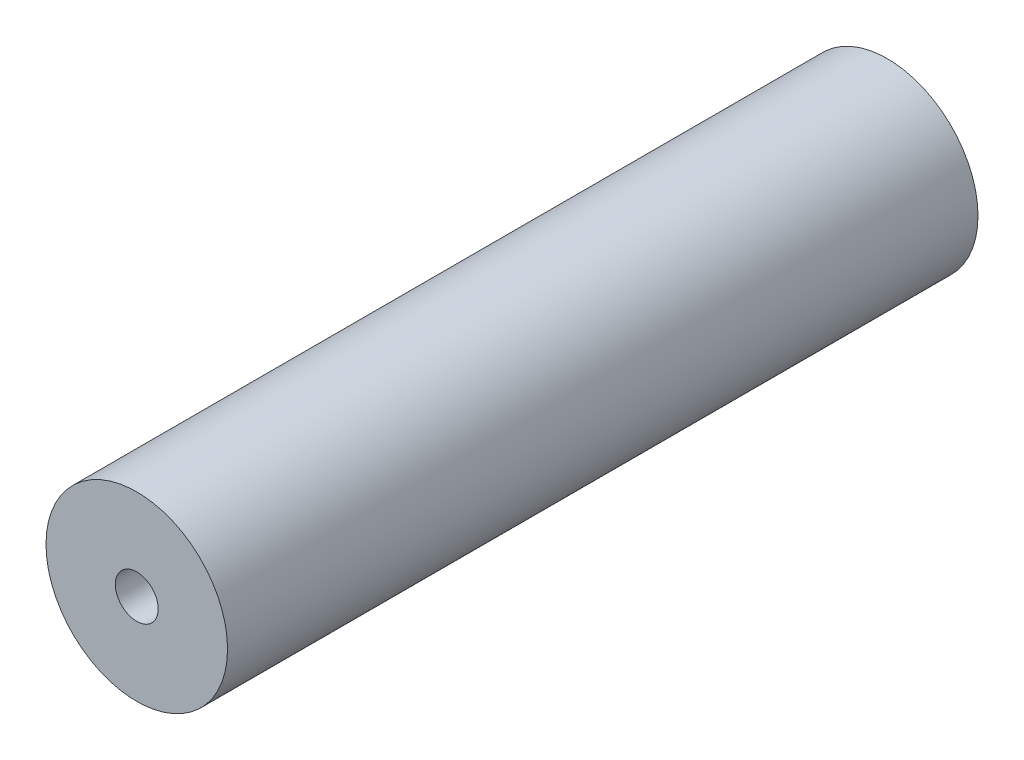
ISO-10303-21;
HEADER;
FILE_DESCRIPTION(('STEP AP214'),'2;1');
FILE_NAME('part.step','',(''),(''),'','','');
FILE_SCHEMA(('AUTOMOTIVE_DESIGN { 1 0 10303 214 1 1 1 1 }'));
ENDSEC;
DATA;
#1=APPLICATION_CONTEXT('core data for automotive mechanical design processes');
#2=APPLICATION_PROTOCOL_DEFINITION('international standard','automotive_design',2000,#1);
#3=PRODUCT_CONTEXT('',#1,'mechanical');
#4=PRODUCT('Part','Part','',(#3));
#5=PRODUCT_RELATED_PRODUCT_CATEGORY('part','',(#4));
#6=PRODUCT_DEFINITION_FORMATION('','',#4);
#7=PRODUCT_DEFINITION_CONTEXT('part definition',#1,'design');
#8=PRODUCT_DEFINITION('design','',#6,#7);
#9=PRODUCT_DEFINITION_SHAPE('','',#8);
#10=(LENGTH_UNIT() NAMED_UNIT(*) SI_UNIT(.MILLI.,.METRE.));
#11=(NAMED_UNIT(*) PLANE_ANGLE_UNIT() SI_UNIT($,.RADIAN.));
#12=(NAMED_UNIT(*) SI_UNIT($,.STERADIAN.) SOLID_ANGLE_UNIT());
#13=UNCERTAINTY_MEASURE_WITH_UNIT(LENGTH_MEASURE(1.E-05),#10,'distance_accuracy_value','');
#14=(GEOMETRIC_REPRESENTATION_CONTEXT(3) GLOBAL_UNCERTAINTY_ASSIGNED_CONTEXT((#13)) GLOBAL_UNIT_ASSIGNED_CONTEXT((#10,
#11,#12)) REPRESENTATION_CONTEXT('',''));
#15=CARTESIAN_POINT('',(0.,0.,0.));
#16=DIRECTION('',(0.,0.,1.));
#17=DIRECTION('',(1.,0.,0.));
#18=AXIS2_PLACEMENT_3D('',#15,#16,#17);
#19=CARTESIAN_POINT('',(-80.,0.,52.5));
#20=DIRECTION('',(0.,0.,-1.));
#21=DIRECTION('',(-1.,0.,0.));
#22=AXIS2_PLACEMENT_3D('',#19,#20,#21);
#23=CYLINDRICAL_SURFACE('',#22,12.7);
#24=CARTESIAN_POINT('',(-80.,0.,52.5));
#25=DIRECTION('',(0.,0.,1.));
#26=DIRECTION('',(1.,0.,0.));
#27=AXIS2_PLACEMENT_3D('',#24,#25,#26);
#28=CIRCLE('',#27,12.7);
#29=CARTESIAN_POINT('',(-67.3,0.,52.5));
#30=VERTEX_POINT('',#29);
#31=EDGE_CURVE('E11',#30,#30,#28,.T.);
#32=ORIENTED_EDGE('',*,*,#31,.F.);
#33=EDGE_LOOP('',(#32));
#34=FACE_BOUND('',#33,.T.);
#35=CARTESIAN_POINT('',(-80.,0.,-52.5));
#36=DIRECTION('',(0.,0.,1.));
#37=DIRECTION('',(1.,0.,0.));
#38=AXIS2_PLACEMENT_3D('',#35,#36,#37);
#39=CIRCLE('',#38,12.7);
#40=CARTESIAN_POINT('',(-67.3,0.,-52.5));
#41=VERTEX_POINT('',#40);
#42=EDGE_CURVE('E52',#41,#41,#39,.T.);
#43=ORIENTED_EDGE('',*,*,#42,.T.);
#44=EDGE_LOOP('',(#43));
#45=FACE_BOUND('',#44,.T.);
#46=ADVANCED_FACE('F44',(#34,#45),#23,.T.);
#47=CARTESIAN_POINT('',(-80.,0.,52.5));
#48=DIRECTION('',(0.,0.,1.));
#49=DIRECTION('',(1.,0.,0.));
#50=AXIS2_PLACEMENT_3D('',#47,#48,#49);
#51=PLANE('',#50);
#52=CARTESIAN_POINT('',(-80.,0.,52.5));
#53=DIRECTION('',(0.,0.,1.));
#54=DIRECTION('',(1.,0.,0.));
#55=AXIS2_PLACEMENT_3D('',#52,#53,#54);
#56=CIRCLE('',#55,3.00000000000001);
#57=CARTESIAN_POINT('',(-77.,0.,52.5));
#58=VERTEX_POINT('',#57);
#59=EDGE_CURVE('E58',#58,#58,#56,.F.);
#60=ORIENTED_EDGE('',*,*,#59,.T.);
#61=EDGE_LOOP('',(#60));
#62=FACE_BOUND('',#61,.T.);
#63=ORIENTED_EDGE('',*,*,#31,.T.);
#64=EDGE_LOOP('',(#63));
#65=FACE_BOUND('',#64,.T.);
#66=ADVANCED_FACE('F88',(#62,#65),#51,.T.);
#67=CARTESIAN_POINT('',(-80.,0.,-52.5));
#68=DIRECTION('',(0.,0.,1.));
#69=DIRECTION('',(1.,0.,0.));
#70=AXIS2_PLACEMENT_3D('',#67,#68,#69);
#71=PLANE('',#70);
#72=CARTESIAN_POINT('',(-80.,0.,-52.5));
#73=DIRECTION('',(0.,0.,-1.));
#74=DIRECTION('',(-1.,0.,0.));
#75=AXIS2_PLACEMENT_3D('',#72,#73,#74);
#76=CIRCLE('',#75,8.5);
#77=CARTESIAN_POINT('',(-88.5,0.,-52.5));
#78=VERTEX_POINT('',#77);
#79=EDGE_CURVE('E71',#78,#78,#76,.T.);
#80=ORIENTED_EDGE('',*,*,#79,.F.);
#81=EDGE_LOOP('',(#80));
#82=FACE_BOUND('',#81,.T.);
#83=ORIENTED_EDGE('',*,*,#42,.F.);
#84=EDGE_LOOP('',(#83));
#85=FACE_BOUND('',#84,.T.);
#86=ADVANCED_FACE('F93',(#82,#85),#71,.F.);
#87=CARTESIAN_POINT('',(-80.,0.,52.501));
#88=DIRECTION('',(0.,0.,-1.));
#89=DIRECTION('',(-1.,0.,0.));
#90=AXIS2_PLACEMENT_3D('',#87,#88,#89);
#91=CYLINDRICAL_SURFACE('',#90,3.00000000000001);
#92=CARTESIAN_POINT('',(-80.,0.,-47.5));
#93=DIRECTION('',(0.,0.,1.));
#94=DIRECTION('',(1.,0.,0.));
#95=AXIS2_PLACEMENT_3D('',#92,#93,#94);
#96=CIRCLE('',#95,3.00000000000001);
#97=CARTESIAN_POINT('',(-77.,0.,-47.5));
#98=VERTEX_POINT('',#97);
#99=EDGE_CURVE('E47',#98,#98,#96,.F.);
#100=ORIENTED_EDGE('',*,*,#99,.T.);
#101=EDGE_LOOP('',(#100));
#102=FACE_BOUND('',#101,.T.);
#103=ORIENTED_EDGE('',*,*,#59,.F.);
#104=EDGE_LOOP('',(#103));
#105=FACE_BOUND('',#104,.T.);
#106=ADVANCED_FACE('F90',(#102,#105),#91,.F.);
#107=CARTESIAN_POINT('',(-80.,0.,-51.225));
#108=DIRECTION('',(0.,0.,1.));
#109=DIRECTION('',(1.,0.,0.));
#110=AXIS2_PLACEMENT_3D('',#107,#108,#109);
#111=PLANE('',#110);
#112=CARTESIAN_POINT('',(-80.,0.,-51.225));
#113=DIRECTION('',(0.,0.,1.));
#114=DIRECTION('',(1.,0.,0.));
#115=AXIS2_PLACEMENT_3D('',#112,#113,#114);
#116=CIRCLE('',#115,7.5);
#117=CARTESIAN_POINT('',(-87.5,0.,-51.225));
#118=VERTEX_POINT('',#117);
#119=EDGE_CURVE('E62',#118,#118,#116,.T.);
#120=ORIENTED_EDGE('',*,*,#119,.T.);
#121=EDGE_LOOP('',(#120));
#122=FACE_BOUND('',#121,.T.);
#123=CARTESIAN_POINT('',(-80.,0.,-51.225));
#124=DIRECTION('',(0.,0.,1.));
#125=DIRECTION('',(1.,0.,0.));
#126=AXIS2_PLACEMENT_3D('',#123,#124,#125);
#127=CIRCLE('',#126,8.5);
#128=CARTESIAN_POINT('',(-71.5,0.,-51.225));
#129=VERTEX_POINT('',#128);
#130=EDGE_CURVE('E79',#129,#129,#127,.F.);
#131=ORIENTED_EDGE('',*,*,#130,.T.);
#132=EDGE_LOOP('',(#131));
#133=FACE_BOUND('',#132,.T.);
#134=ADVANCED_FACE('F92',(#122,#133),#111,.F.);
#135=CARTESIAN_POINT('',(-80.,0.,-25.9083694396574));
#136=DIRECTION('',(0.,0.,-1.));
#137=DIRECTION('',(-1.,0.,0.));
#138=AXIS2_PLACEMENT_3D('',#135,#136,#137);
#139=CYLINDRICAL_SURFACE('',#138,8.5);
#140=ORIENTED_EDGE('',*,*,#79,.T.);
#141=EDGE_LOOP('',(#140));
#142=FACE_BOUND('',#141,.T.);
#143=ORIENTED_EDGE('',*,*,#130,.F.);
#144=EDGE_LOOP('',(#143));
#145=FACE_BOUND('',#144,.T.);
#146=ADVANCED_FACE('F100',(#142,#145),#139,.F.);
#147=CARTESIAN_POINT('',(-80.,0.,-47.5));
#148=DIRECTION('',(0.,0.,1.));
#149=DIRECTION('',(1.,0.,0.));
#150=AXIS2_PLACEMENT_3D('',#147,#148,#149);
#151=PLANE('',#150);
#152=CARTESIAN_POINT('',(-80.,0.,-47.5));
#153=DIRECTION('',(0.,0.,1.));
#154=DIRECTION('',(1.,0.,0.));
#155=AXIS2_PLACEMENT_3D('',#152,#153,#154);
#156=CIRCLE('',#155,7.5);
#157=CARTESIAN_POINT('',(-87.5,0.,-47.5));
#158=VERTEX_POINT('',#157);
#159=EDGE_CURVE('E65',#158,#158,#156,.F.);
#160=ORIENTED_EDGE('',*,*,#159,.T.);
#161=EDGE_LOOP('',(#160));
#162=FACE_BOUND('',#161,.T.);
#163=ORIENTED_EDGE('',*,*,#99,.F.);
#164=EDGE_LOOP('',(#163));
#165=FACE_BOUND('',#164,.T.);
#166=ADVANCED_FACE('F129',(#162,#165),#151,.F.);
#167=CARTESIAN_POINT('',(-80.,0.,-21.2867965644036));
#168=DIRECTION('',(0.,0.,-1.));
#169=DIRECTION('',(-1.,0.,0.));
#170=AXIS2_PLACEMENT_3D('',#167,#168,#169);
#171=CYLINDRICAL_SURFACE('',#170,7.5);
#172=CARTESIAN_POINT('',(-87.5,0.,-47.5));
#173=CARTESIAN_POINT('',(-87.5,0.,-47.5388020833333));
#174=CARTESIAN_POINT('',(-87.5,0.,-47.5776041666667));
#175=CARTESIAN_POINT('',(-87.5,0.,-47.6552083333333));
#176=CARTESIAN_POINT('',(-87.5,0.,-47.6940104166667));
#177=CARTESIAN_POINT('',(-87.5,0.,-47.7716145833333));
#178=CARTESIAN_POINT('',(-87.5,0.,-47.8104166666667));
#179=CARTESIAN_POINT('',(-87.5,0.,-47.8880208333333));
#180=CARTESIAN_POINT('',(-87.5,0.,-47.9268229166667));
#181=CARTESIAN_POINT('',(-87.5,0.,-48.0044270833333));
#182=CARTESIAN_POINT('',(-87.5,0.,-48.0432291666667));
#183=CARTESIAN_POINT('',(-87.5,0.,-48.1208333333333));
#184=CARTESIAN_POINT('',(-87.5,0.,-48.1596354166667));
#185=CARTESIAN_POINT('',(-87.5,0.,-48.2372395833333));
#186=CARTESIAN_POINT('',(-87.5,0.,-48.2760416666667));
#187=CARTESIAN_POINT('',(-87.5,0.,-48.3536458333333));
#188=CARTESIAN_POINT('',(-87.5,0.,-48.3924479166667));
#189=CARTESIAN_POINT('',(-87.5,0.,-48.4700520833333));
#190=CARTESIAN_POINT('',(-87.5,0.,-48.5088541666667));
#191=CARTESIAN_POINT('',(-87.5,0.,-48.5864583333333));
#192=CARTESIAN_POINT('',(-87.5,0.,-48.6252604166667));
#193=CARTESIAN_POINT('',(-87.5,0.,-48.7028645833333));
#194=CARTESIAN_POINT('',(-87.5,0.,-48.7416666666667));
#195=CARTESIAN_POINT('',(-87.5,0.,-48.8192708333333));
#196=CARTESIAN_POINT('',(-87.5,0.,-48.8580729166667));
#197=CARTESIAN_POINT('',(-87.5,0.,-48.9356770833333));
#198=CARTESIAN_POINT('',(-87.5,0.,-48.9744791666667));
#199=CARTESIAN_POINT('',(-87.5,0.,-49.0520833333333));
#200=CARTESIAN_POINT('',(-87.5,0.,-49.0908854166667));
#201=CARTESIAN_POINT('',(-87.5,0.,-49.1684895833333));
#202=CARTESIAN_POINT('',(-87.5,0.,-49.2072916666667));
#203=CARTESIAN_POINT('',(-87.5,0.,-49.2848958333333));
#204=CARTESIAN_POINT('',(-87.5,0.,-49.3236979166667));
#205=CARTESIAN_POINT('',(-87.5,0.,-49.4013020833333));
#206=CARTESIAN_POINT('',(-87.5,0.,-49.4401041666667));
#207=CARTESIAN_POINT('',(-87.5,0.,-49.5177083333333));
#208=CARTESIAN_POINT('',(-87.5,0.,-49.5565104166667));
#209=CARTESIAN_POINT('',(-87.5,0.,-49.6341145833333));
#210=CARTESIAN_POINT('',(-87.5,0.,-49.6729166666667));
#211=CARTESIAN_POINT('',(-87.5,0.,-49.7505208333333));
#212=CARTESIAN_POINT('',(-87.5,0.,-49.7893229166667));
#213=CARTESIAN_POINT('',(-87.5,0.,-49.8669270833333));
#214=CARTESIAN_POINT('',(-87.5,0.,-49.9057291666667));
#215=CARTESIAN_POINT('',(-87.5,0.,-49.9833333333333));
#216=CARTESIAN_POINT('',(-87.5,0.,-50.0221354166667));
#217=CARTESIAN_POINT('',(-87.5,0.,-50.0997395833333));
#218=CARTESIAN_POINT('',(-87.5,0.,-50.1385416666667));
#219=CARTESIAN_POINT('',(-87.5,0.,-50.2161458333333));
#220=CARTESIAN_POINT('',(-87.5,0.,-50.2549479166667));
#221=CARTESIAN_POINT('',(-87.5,0.,-50.3325520833333));
#222=CARTESIAN_POINT('',(-87.5,0.,-50.3713541666667));
#223=CARTESIAN_POINT('',(-87.5,0.,-50.4489583333333));
#224=CARTESIAN_POINT('',(-87.5,0.,-50.4877604166667));
#225=CARTESIAN_POINT('',(-87.5,0.,-50.5653645833333));
#226=CARTESIAN_POINT('',(-87.5,0.,-50.6041666666667));
#227=CARTESIAN_POINT('',(-87.5,0.,-50.6817708333333));
#228=CARTESIAN_POINT('',(-87.5,0.,-50.7205729166667));
#229=CARTESIAN_POINT('',(-87.5,0.,-50.7981770833333));
#230=CARTESIAN_POINT('',(-87.5,0.,-50.8369791666667));
#231=CARTESIAN_POINT('',(-87.5,0.,-50.9145833333333));
#232=CARTESIAN_POINT('',(-87.5,0.,-50.9533854166667));
#233=CARTESIAN_POINT('',(-87.5,0.,-51.0309895833333));
#234=CARTESIAN_POINT('',(-87.5,0.,-51.0697916666667));
#235=CARTESIAN_POINT('',(-87.5,0.,-51.1473958333333));
#236=CARTESIAN_POINT('',(-87.5,0.,-51.1861979166667));
#237=CARTESIAN_POINT('',(-87.5,0.,-51.225));
#238=B_SPLINE_CURVE_WITH_KNOTS('',3,(#172,#173,#174,#175,#176,#177,#178,#179,#180,#181,#182,
#183,#184,#185,#186,#187,#188,#189,#190,#191,#192,#193,#194,#195,#196,#197,#198,#199,#200,#201,
#202,#203,#204,#205,#206,#207,#208,#209,#210,#211,#212,#213,#214,#215,#216,#217,#218,#219,#220,
#221,#222,#223,#224,#225,#226,#227,#228,#229,#230,#231,#232,#233,#234,#235,#236,#237),
.UNSPECIFIED.,.F.,.F.,(4,2,2,2,2,2,2,2,2,2,2,2,2,2,2,2,2,2,2,2,2,2,2,2,2,2,2,2,2,2,2,2,4),(0.,
0.116406249999999,0.232812499999999,0.349218749999998,0.465624999999997,0.582031249999997,
0.698437500000003,0.814843749999995,0.931250000000001,1.04765624999999,1.1640625,
1.28046874999999,1.396875,1.51328125,1.6296875,1.74609375,1.8625,1.97890625,2.09531249999999,
2.21171874999999,2.32812499999999,2.44453125,2.56093749999999,2.67734375,2.79374999999999,
2.91015625,3.02656249999999,3.14296875,3.259375,3.37578124999999,3.49218749999999,
3.60859374999999,3.72499999999999),.UNSPECIFIED.);
#239=EDGE_CURVE('BSEAM154',#158,#118,#238,.T.);
#240=ORIENTED_EDGE('',*,*,#159,.F.);
#241=ORIENTED_EDGE('',*,*,#119,.F.);
#242=ORIENTED_EDGE('',*,*,#239,.T.);
#243=ORIENTED_EDGE('',*,*,#239,.F.);
#244=EDGE_LOOP('',(#240,#242,#241,#243));
#245=FACE_BOUND('',#244,.T.);
#246=ADVANCED_FACE('F154',(#245),#171,.F.);
#247=CLOSED_SHELL('',(#46,#66,#86,#106,#134,#146,#166,#246));
#248=MANIFOLD_SOLID_BREP('B2',#247);
#249=ADVANCED_BREP_SHAPE_REPRESENTATION('',(#18,#248),#14);
#250=SHAPE_DEFINITION_REPRESENTATION(#9,#249);
ENDSEC;
END-ISO-10303-21;
